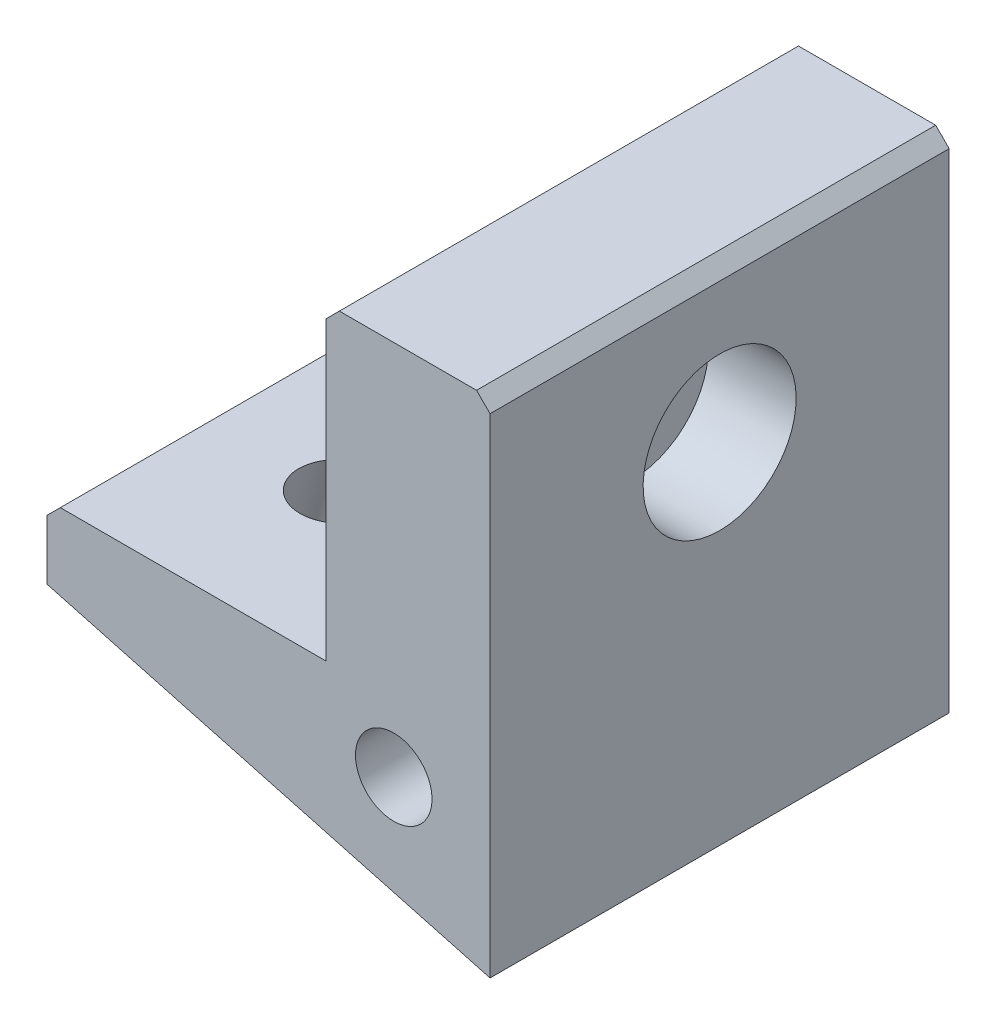
ISO-10303-21;
HEADER;
FILE_DESCRIPTION(('STEP AP214'),'2;1');
FILE_NAME('part.step','',(''),(''),'','','');
FILE_SCHEMA(('AUTOMOTIVE_DESIGN { 1 0 10303 214 1 1 1 1 }'));
ENDSEC;
DATA;
#1=APPLICATION_CONTEXT('core data for automotive mechanical design processes');
#2=APPLICATION_PROTOCOL_DEFINITION('international standard','automotive_design',2000,#1);
#3=PRODUCT_CONTEXT('',#1,'mechanical');
#4=PRODUCT('Part','Part','',(#3));
#5=PRODUCT_RELATED_PRODUCT_CATEGORY('part','',(#4));
#6=PRODUCT_DEFINITION_FORMATION('','',#4);
#7=PRODUCT_DEFINITION_CONTEXT('part definition',#1,'design');
#8=PRODUCT_DEFINITION('design','',#6,#7);
#9=PRODUCT_DEFINITION_SHAPE('','',#8);
#10=(LENGTH_UNIT() NAMED_UNIT(*) SI_UNIT(.MILLI.,.METRE.));
#11=(NAMED_UNIT(*) PLANE_ANGLE_UNIT() SI_UNIT($,.RADIAN.));
#12=(NAMED_UNIT(*) SI_UNIT($,.STERADIAN.) SOLID_ANGLE_UNIT());
#13=UNCERTAINTY_MEASURE_WITH_UNIT(LENGTH_MEASURE(1.E-05),#10,'distance_accuracy_value','');
#14=(GEOMETRIC_REPRESENTATION_CONTEXT(3) GLOBAL_UNCERTAINTY_ASSIGNED_CONTEXT((#13)) GLOBAL_UNIT_ASSIGNED_CONTEXT((#10,
#11,#12)) REPRESENTATION_CONTEXT('',''));
#15=CARTESIAN_POINT('',(0.,0.,0.));
#16=DIRECTION('',(0.,0.,1.));
#17=DIRECTION('',(1.,0.,0.));
#18=AXIS2_PLACEMENT_3D('',#15,#16,#17);
#19=CARTESIAN_POINT('',(0.,11.0097285067709,19.05));
#20=DIRECTION('',(0.,-1.,0.));
#21=DIRECTION('',(0.,0.,-1.));
#22=AXIS2_PLACEMENT_3D('',#19,#20,#21);
#23=PLANE('',#22);
#24=CARTESIAN_POINT('',(-6.89498166197876,11.0097285067709,6.35));
#25=DIRECTION('',(0.,-1.,0.));
#26=DIRECTION('',(-1.,0.,0.));
#27=AXIS2_PLACEMENT_3D('',#24,#25,#26);
#28=ELLIPSE('',#27,3.28854480018623,3.17499999999999);
#29=CARTESIAN_POINT('',(-10.183526462165,11.0097285067709,6.35));
#30=VERTEX_POINT('',#29);
#31=EDGE_CURVE('E188',#30,#30,#28,.T.);
#32=ORIENTED_EDGE('',*,*,#31,.T.);
#33=EDGE_LOOP('',(#32));
#34=FACE_BOUND('',#33,.T.);
#35=CARTESIAN_POINT('',(-6.89498166197876,11.0097285067709,-6.35));
#36=DIRECTION('',(0.,-1.,0.));
#37=DIRECTION('',(-1.,0.,0.));
#38=AXIS2_PLACEMENT_3D('',#35,#36,#37);
#39=ELLIPSE('',#38,3.28854480018623,3.17499999999999);
#40=CARTESIAN_POINT('',(-10.183526462165,11.0097285067709,-6.35));
#41=VERTEX_POINT('',#40);
#42=EDGE_CURVE('E179',#41,#41,#39,.T.);
#43=ORIENTED_EDGE('',*,*,#42,.T.);
#44=EDGE_LOOP('',(#43));
#45=FACE_BOUND('',#44,.T.);
#46=DIRECTION('',(-1.,0.,0.));
#47=VECTOR('',#46,1.);
#48=CARTESIAN_POINT('',(0.,11.0097285067709,-19.05));
#49=LINE('',#48,#47);
#50=CARTESIAN_POINT('',(4.7625,11.0097285067709,-19.05));
#51=VERTEX_POINT('',#50);
#52=CARTESIAN_POINT('',(-17.2697216031156,11.0097285067709,-19.05));
#53=VERTEX_POINT('',#52);
#54=EDGE_CURVE('E142',#51,#53,#49,.T.);
#55=ORIENTED_EDGE('',*,*,#54,.T.);
#56=DIRECTION('',(0.,0.,-1.));
#57=VECTOR('',#56,1.);
#58=CARTESIAN_POINT('',(-17.2697216031156,11.0097285067709,19.05));
#59=LINE('',#58,#57);
#60=CARTESIAN_POINT('',(-17.2697216031156,11.0097285067709,19.05));
#61=VERTEX_POINT('',#60);
#62=EDGE_CURVE('E11',#61,#53,#59,.T.);
#63=ORIENTED_EDGE('',*,*,#62,.F.);
#64=DIRECTION('',(-1.,0.,0.));
#65=VECTOR('',#64,1.);
#66=CARTESIAN_POINT('',(0.,11.0097285067709,19.05));
#67=LINE('',#66,#65);
#68=CARTESIAN_POINT('',(4.7625,11.0097285067709,19.05));
#69=VERTEX_POINT('',#68);
#70=EDGE_CURVE('E93',#69,#61,#67,.T.);
#71=ORIENTED_EDGE('',*,*,#70,.F.);
#72=DIRECTION('',(0.,0.,-1.));
#73=VECTOR('',#72,1.);
#74=CARTESIAN_POINT('',(4.7625,11.0097285067709,19.05));
#75=LINE('',#74,#73);
#76=EDGE_CURVE('E53',#69,#51,#75,.T.);
#77=ORIENTED_EDGE('',*,*,#76,.T.);
#78=EDGE_LOOP('',(#55,#63,#71,#77));
#79=FACE_BOUND('',#78,.T.);
#80=ADVANCED_FACE('F35',(#34,#45,#79),#23,.F.);
#81=CARTESIAN_POINT('',(-14.1397250549432,14.1397250549432,19.05));
#82=DIRECTION('',(-0.707106781186548,0.707106781186548,0.));
#83=DIRECTION('',(-0.707106781186548,-0.707106781186548,0.));
#84=AXIS2_PLACEMENT_3D('',#81,#82,#83);
#85=PLANE('',#84);
#86=DIRECTION('',(0.707106781186548,0.707106781186548,0.));
#87=VECTOR('',#86,1.);
#88=CARTESIAN_POINT('',(-14.1397250549432,14.1397250549432,-19.05));
#89=LINE('',#88,#87);
#90=CARTESIAN_POINT('',(-18.3922536182492,9.88719649163726,-19.05));
#91=VERTEX_POINT('',#90);
#92=EDGE_CURVE('E144',#91,#53,#89,.T.);
#93=ORIENTED_EDGE('',*,*,#92,.F.);
#94=DIRECTION('',(0.,0.,-1.));
#95=VECTOR('',#94,1.);
#96=CARTESIAN_POINT('',(-18.3922536182492,9.88719649163726,19.05));
#97=LINE('',#96,#95);
#98=CARTESIAN_POINT('',(-18.3922536182492,9.88719649163726,19.05));
#99=VERTEX_POINT('',#98);
#100=EDGE_CURVE('E44',#99,#91,#97,.T.);
#101=ORIENTED_EDGE('',*,*,#100,.F.);
#102=DIRECTION('',(0.707106781186548,0.707106781186548,0.));
#103=VECTOR('',#102,1.);
#104=CARTESIAN_POINT('',(-14.1397250549432,14.1397250549432,19.05));
#105=LINE('',#104,#103);
#106=EDGE_CURVE('E193',#99,#61,#105,.T.);
#107=ORIENTED_EDGE('',*,*,#106,.T.);
#108=ORIENTED_EDGE('',*,*,#62,.T.);
#109=EDGE_LOOP('',(#93,#101,#107,#108));
#110=FACE_BOUND('',#109,.T.);
#111=ADVANCED_FACE('F223',(#110),#85,.T.);
#112=CARTESIAN_POINT('',(-18.3922536182492,0.,19.05));
#113=DIRECTION('',(-1.,0.,0.));
#114=DIRECTION('',(0.,0.,1.));
#115=AXIS2_PLACEMENT_3D('',#112,#113,#114);
#116=PLANE('',#115);
#117=DIRECTION('',(0.,1.,0.));
#118=VECTOR('',#117,1.);
#119=CARTESIAN_POINT('',(-18.3922536182492,0.,-19.05));
#120=LINE('',#119,#118);
#121=CARTESIAN_POINT('',(-18.3922536182492,4.96261088964253,-19.05));
#122=VERTEX_POINT('',#121);
#123=EDGE_CURVE('E148',#122,#91,#120,.T.);
#124=ORIENTED_EDGE('',*,*,#123,.F.);
#125=DIRECTION('',(0.,0.,-1.));
#126=VECTOR('',#125,1.);
#127=CARTESIAN_POINT('',(-18.3922536182492,4.96261088964253,19.05));
#128=LINE('',#127,#126);
#129=CARTESIAN_POINT('',(-18.3922536182492,4.96261088964253,19.05));
#130=VERTEX_POINT('',#129);
#131=EDGE_CURVE('E176',#130,#122,#128,.T.);
#132=ORIENTED_EDGE('',*,*,#131,.F.);
#133=DIRECTION('',(0.,1.,0.));
#134=VECTOR('',#133,1.);
#135=CARTESIAN_POINT('',(-18.3922536182492,0.,19.05));
#136=LINE('',#135,#134);
#137=EDGE_CURVE('E196',#130,#99,#136,.T.);
#138=ORIENTED_EDGE('',*,*,#137,.T.);
#139=ORIENTED_EDGE('',*,*,#100,.T.);
#140=EDGE_LOOP('',(#124,#132,#138,#139));
#141=FACE_BOUND('',#140,.T.);
#142=ADVANCED_FACE('F228',(#141),#116,.T.);
#143=CARTESIAN_POINT('',(0.,0.,19.05));
#144=DIRECTION('',(0.260504508642652,0.965472630879224,0.));
#145=DIRECTION('',(-0.965472630879224,0.260504508642652,0.));
#146=AXIS2_PLACEMENT_3D('',#143,#144,#145);
#147=PLANE('',#146);
#148=CARTESIAN_POINT('',(-9.19612680912461,2.48130544482126,6.35));
#149=DIRECTION('',(-0.260504508642652,-0.965472630879224,0.));
#150=DIRECTION('',(0.965472630879224,-0.260504508642652,0.));
#151=AXIS2_PLACEMENT_3D('',#148,#149,#150);
#152=CIRCLE('',#151,3.17499999999999);
#153=CARTESIAN_POINT('',(-6.13075120608308,1.65420362988084,6.35));
#154=VERTEX_POINT('',#153);
#155=EDGE_CURVE('E388',#154,#154,#152,.T.);
#156=ORIENTED_EDGE('',*,*,#155,.F.);
#157=EDGE_LOOP('',(#156));
#158=FACE_BOUND('',#157,.T.);
#159=CARTESIAN_POINT('',(-9.19612680912461,2.48130544482126,-6.35));
#160=DIRECTION('',(-0.260504508642652,-0.965472630879224,0.));
#161=DIRECTION('',(0.965472630879224,-0.260504508642652,0.));
#162=AXIS2_PLACEMENT_3D('',#159,#160,#161);
#163=CIRCLE('',#162,3.17499999999999);
#164=CARTESIAN_POINT('',(-6.13075120608308,1.65420362988084,-6.35));
#165=VERTEX_POINT('',#164);
#166=EDGE_CURVE('E183',#165,#165,#163,.T.);
#167=ORIENTED_EDGE('',*,*,#166,.F.);
#168=EDGE_LOOP('',(#167));
#169=FACE_BOUND('',#168,.T.);
#170=DIRECTION('',(0.965472630879224,-0.260504508642652,0.));
#171=VECTOR('',#170,1.);
#172=CARTESIAN_POINT('',(0.,0.,-19.05));
#173=LINE('',#172,#171);
#174=CARTESIAN_POINT('',(18.3922536182492,-4.96261088964252,-19.05));
#175=VERTEX_POINT('',#174);
#176=EDGE_CURVE('E151',#122,#175,#173,.T.);
#177=ORIENTED_EDGE('',*,*,#176,.T.);
#178=DIRECTION('',(0.,0.,-1.));
#179=VECTOR('',#178,1.);
#180=CARTESIAN_POINT('',(18.3922536182492,-4.96261088964252,19.05));
#181=LINE('',#180,#179);
#182=CARTESIAN_POINT('',(18.3922536182492,-4.96261088964252,19.05));
#183=VERTEX_POINT('',#182);
#184=EDGE_CURVE('E174',#183,#175,#181,.T.);
#185=ORIENTED_EDGE('',*,*,#184,.F.);
#186=DIRECTION('',(0.965472630879224,-0.260504508642652,0.));
#187=VECTOR('',#186,1.);
#188=CARTESIAN_POINT('',(0.,0.,19.05));
#189=LINE('',#188,#187);
#190=EDGE_CURVE('E199',#130,#183,#189,.T.);
#191=ORIENTED_EDGE('',*,*,#190,.F.);
#192=ORIENTED_EDGE('',*,*,#131,.T.);
#193=EDGE_LOOP('',(#177,#185,#191,#192));
#194=FACE_BOUND('',#193,.T.);
#195=ADVANCED_FACE('F240',(#158,#169,#194),#147,.F.);
#196=CARTESIAN_POINT('',(18.3922536182492,0.,19.05));
#197=DIRECTION('',(1.,0.,0.));
#198=DIRECTION('',(0.,0.,-1.));
#199=AXIS2_PLACEMENT_3D('',#196,#197,#198);
#200=PLANE('',#199);
#201=CARTESIAN_POINT('',(18.3922536182492,24.0126108896425,0.));
#202=DIRECTION('',(-1.,0.,0.));
#203=DIRECTION('',(0.,-1.,0.));
#204=AXIS2_PLACEMENT_3D('',#201,#202,#203);
#205=CIRCLE('',#204,6.35);
#206=CARTESIAN_POINT('',(18.3922536182492,17.6626108896425,0.));
#207=VERTEX_POINT('',#206);
#208=EDGE_CURVE('E381',#207,#207,#205,.T.);
#209=ORIENTED_EDGE('',*,*,#208,.T.);
#210=EDGE_LOOP('',(#209));
#211=FACE_BOUND('',#210,.T.);
#212=DIRECTION('',(0.,-1.,0.));
#213=VECTOR('',#212,1.);
#214=CARTESIAN_POINT('',(18.3922536182492,0.,-19.05));
#215=LINE('',#214,#213);
#216=CARTESIAN_POINT('',(18.3922536182492,35.5900788745089,-19.05));
#217=VERTEX_POINT('',#216);
#218=EDGE_CURVE('E154',#217,#175,#215,.T.);
#219=ORIENTED_EDGE('',*,*,#218,.F.);
#220=DIRECTION('',(0.,0.,-1.));
#221=VECTOR('',#220,1.);
#222=CARTESIAN_POINT('',(18.3922536182492,35.5900788745089,19.05));
#223=LINE('',#222,#221);
#224=CARTESIAN_POINT('',(18.3922536182492,35.5900788745089,19.05));
#225=VERTEX_POINT('',#224);
#226=EDGE_CURVE('E172',#225,#217,#223,.T.);
#227=ORIENTED_EDGE('',*,*,#226,.F.);
#228=DIRECTION('',(0.,-1.,0.));
#229=VECTOR('',#228,1.);
#230=CARTESIAN_POINT('',(18.3922536182492,0.,19.05));
#231=LINE('',#230,#229);
#232=EDGE_CURVE('E201',#225,#183,#231,.T.);
#233=ORIENTED_EDGE('',*,*,#232,.T.);
#234=ORIENTED_EDGE('',*,*,#184,.T.);
#235=EDGE_LOOP('',(#219,#227,#233,#234));
#236=FACE_BOUND('',#235,.T.);
#237=ADVANCED_FACE('F242',(#211,#236),#200,.T.);
#238=CARTESIAN_POINT('',(26.991166246379,26.991166246379,19.05));
#239=DIRECTION('',(0.707106781186548,0.707106781186548,0.));
#240=DIRECTION('',(-0.707106781186548,0.707106781186548,0.));
#241=AXIS2_PLACEMENT_3D('',#238,#239,#240);
#242=PLANE('',#241);
#243=DIRECTION('',(0.707106781186548,-0.707106781186548,0.));
#244=VECTOR('',#243,1.);
#245=CARTESIAN_POINT('',(26.991166246379,26.991166246379,-19.05));
#246=LINE('',#245,#244);
#247=CARTESIAN_POINT('',(17.2697216031156,36.7126108896425,-19.05));
#248=VERTEX_POINT('',#247);
#249=EDGE_CURVE('E157',#248,#217,#246,.T.);
#250=ORIENTED_EDGE('',*,*,#249,.F.);
#251=DIRECTION('',(0.,0.,-1.));
#252=VECTOR('',#251,1.);
#253=CARTESIAN_POINT('',(17.2697216031156,36.7126108896425,19.05));
#254=LINE('',#253,#252);
#255=CARTESIAN_POINT('',(17.2697216031156,36.7126108896425,19.05));
#256=VERTEX_POINT('',#255);
#257=EDGE_CURVE('E122',#256,#248,#254,.T.);
#258=ORIENTED_EDGE('',*,*,#257,.F.);
#259=DIRECTION('',(0.707106781186548,-0.707106781186548,0.));
#260=VECTOR('',#259,1.);
#261=CARTESIAN_POINT('',(26.991166246379,26.991166246379,19.05));
#262=LINE('',#261,#260);
#263=EDGE_CURVE('E131',#256,#225,#262,.T.);
#264=ORIENTED_EDGE('',*,*,#263,.T.);
#265=ORIENTED_EDGE('',*,*,#226,.T.);
#266=EDGE_LOOP('',(#250,#258,#264,#265));
#267=FACE_BOUND('',#266,.T.);
#268=ADVANCED_FACE('F205',(#267),#242,.T.);
#269=CARTESIAN_POINT('',(0.,36.7126108896425,19.05));
#270=DIRECTION('',(0.,1.,0.));
#271=DIRECTION('',(-1.,0.,0.));
#272=AXIS2_PLACEMENT_3D('',#269,#270,#271);
#273=PLANE('',#272);
#274=DIRECTION('',(1.,0.,0.));
#275=VECTOR('',#274,1.);
#276=CARTESIAN_POINT('',(0.,36.7126108896425,-19.05));
#277=LINE('',#276,#275);
#278=CARTESIAN_POINT('',(5.88503201513365,36.7126108896425,-19.05));
#279=VERTEX_POINT('',#278);
#280=EDGE_CURVE('E118',#279,#248,#277,.T.);
#281=ORIENTED_EDGE('',*,*,#280,.F.);
#282=DIRECTION('',(0.,0.,-1.));
#283=VECTOR('',#282,1.);
#284=CARTESIAN_POINT('',(5.88503201513365,36.7126108896425,19.05));
#285=LINE('',#284,#283);
#286=CARTESIAN_POINT('',(5.88503201513365,36.7126108896425,19.05));
#287=VERTEX_POINT('',#286);
#288=EDGE_CURVE('E113',#287,#279,#285,.T.);
#289=ORIENTED_EDGE('',*,*,#288,.F.);
#290=DIRECTION('',(1.,0.,0.));
#291=VECTOR('',#290,1.);
#292=CARTESIAN_POINT('',(0.,36.7126108896425,19.05));
#293=LINE('',#292,#291);
#294=EDGE_CURVE('E116',#287,#256,#293,.T.);
#295=ORIENTED_EDGE('',*,*,#294,.T.);
#296=ORIENTED_EDGE('',*,*,#257,.T.);
#297=EDGE_LOOP('',(#281,#289,#295,#296));
#298=FACE_BOUND('',#297,.T.);
#299=ADVANCED_FACE('F115',(#298),#273,.T.);
#300=CARTESIAN_POINT('',(-15.4137894372545,15.4137894372545,19.05));
#301=DIRECTION('',(-0.707106781186546,0.707106781186549,0.));
#302=DIRECTION('',(-0.707106781186549,-0.707106781186546,0.));
#303=AXIS2_PLACEMENT_3D('',#300,#301,#302);
#304=PLANE('',#303);
#305=DIRECTION('',(0.707106781186549,0.707106781186546,0.));
#306=VECTOR('',#305,1.);
#307=CARTESIAN_POINT('',(-15.4137894372545,15.4137894372545,-19.05));
#308=LINE('',#307,#306);
#309=CARTESIAN_POINT('',(4.7625,35.5900788745089,-19.05));
#310=VERTEX_POINT('',#309);
#311=EDGE_CURVE('E161',#310,#279,#308,.T.);
#312=ORIENTED_EDGE('',*,*,#311,.F.);
#313=DIRECTION('',(0.,0.,-1.));
#314=VECTOR('',#313,1.);
#315=CARTESIAN_POINT('',(4.7625,35.5900788745089,19.05));
#316=LINE('',#315,#314);
#317=CARTESIAN_POINT('',(4.7625,35.5900788745089,19.05));
#318=VERTEX_POINT('',#317);
#319=EDGE_CURVE('E81',#318,#310,#316,.T.);
#320=ORIENTED_EDGE('',*,*,#319,.F.);
#321=DIRECTION('',(0.707106781186549,0.707106781186546,0.));
#322=VECTOR('',#321,1.);
#323=CARTESIAN_POINT('',(-15.4137894372545,15.4137894372545,19.05));
#324=LINE('',#323,#322);
#325=EDGE_CURVE('E128',#318,#287,#324,.T.);
#326=ORIENTED_EDGE('',*,*,#325,.T.);
#327=ORIENTED_EDGE('',*,*,#288,.T.);
#328=EDGE_LOOP('',(#312,#320,#326,#327));
#329=FACE_BOUND('',#328,.T.);
#330=ADVANCED_FACE('F133',(#329),#304,.T.);
#331=CARTESIAN_POINT('',(4.7625,0.,19.05));
#332=DIRECTION('',(-1.,0.,0.));
#333=DIRECTION('',(0.,-1.,0.));
#334=AXIS2_PLACEMENT_3D('',#331,#332,#333);
#335=PLANE('',#334);
#336=CARTESIAN_POINT('',(4.7625,24.0126108896425,0.));
#337=DIRECTION('',(-1.,0.,0.));
#338=DIRECTION('',(0.,-1.,0.));
#339=AXIS2_PLACEMENT_3D('',#336,#337,#338);
#340=CIRCLE('',#339,3.175);
#341=CARTESIAN_POINT('',(4.7625,20.8376108896425,0.));
#342=VERTEX_POINT('',#341);
#343=EDGE_CURVE('E145',#342,#342,#340,.T.);
#344=ORIENTED_EDGE('',*,*,#343,.F.);
#345=EDGE_LOOP('',(#344));
#346=FACE_BOUND('',#345,.T.);
#347=DIRECTION('',(0.,1.,0.));
#348=VECTOR('',#347,1.);
#349=CARTESIAN_POINT('',(4.7625,0.,-19.05));
#350=LINE('',#349,#348);
#351=EDGE_CURVE('E163',#51,#310,#350,.T.);
#352=ORIENTED_EDGE('',*,*,#351,.F.);
#353=ORIENTED_EDGE('',*,*,#76,.F.);
#354=DIRECTION('',(0.,1.,0.));
#355=VECTOR('',#354,1.);
#356=CARTESIAN_POINT('',(4.7625,0.,19.05));
#357=LINE('',#356,#355);
#358=EDGE_CURVE('E134',#69,#318,#357,.T.);
#359=ORIENTED_EDGE('',*,*,#358,.T.);
#360=ORIENTED_EDGE('',*,*,#319,.T.);
#361=EDGE_LOOP('',(#352,#353,#359,#360));
#362=FACE_BOUND('',#361,.T.);
#363=ADVANCED_FACE('F210',(#346,#362),#335,.T.);
#364=CARTESIAN_POINT('',(10.3979607447915,5.47460078069408,19.05));
#365=DIRECTION('',(0.,0.,-1.));
#366=DIRECTION('',(-1.,0.,0.));
#367=AXIS2_PLACEMENT_3D('',#364,#365,#366);
#368=CYLINDRICAL_SURFACE('',#367,3.175);
#369=CARTESIAN_POINT('',(10.3979607447915,5.47460078069408,19.05));
#370=DIRECTION('',(0.,0.,1.));
#371=DIRECTION('',(1.,0.,0.));
#372=AXIS2_PLACEMENT_3D('',#369,#370,#371);
#373=CIRCLE('',#372,3.175);
#374=CARTESIAN_POINT('',(7.22296074479154,5.47460078069408,19.05));
#375=VERTEX_POINT('',#374);
#376=EDGE_CURVE('E136',#375,#375,#373,.T.);
#377=CARTESIAN_POINT('',(10.3979607447915,5.47460078069408,-19.05));
#378=DIRECTION('',(0.,0.,1.));
#379=DIRECTION('',(1.,0.,0.));
#380=AXIS2_PLACEMENT_3D('',#377,#378,#379);
#381=CIRCLE('',#380,3.175);
#382=CARTESIAN_POINT('',(7.22296074479154,5.47460078069408,-19.05));
#383=VERTEX_POINT('',#382);
#384=EDGE_CURVE('E166',#383,#383,#381,.T.);
#385=CARTESIAN_POINT('',(7.22296074479154,5.47460078069408,19.05));
#386=CARTESIAN_POINT('',(7.22296074479154,5.47460078069408,18.653125));
#387=CARTESIAN_POINT('',(7.22296074479154,5.47460078069408,18.25625));
#388=CARTESIAN_POINT('',(7.22296074479154,5.47460078069408,17.4625));
#389=CARTESIAN_POINT('',(7.22296074479154,5.47460078069408,17.065625));
#390=CARTESIAN_POINT('',(7.22296074479154,5.47460078069408,16.271875));
#391=CARTESIAN_POINT('',(7.22296074479154,5.47460078069408,15.875));
#392=CARTESIAN_POINT('',(7.22296074479154,5.47460078069408,15.08125));
#393=CARTESIAN_POINT('',(7.22296074479154,5.47460078069408,14.684375));
#394=CARTESIAN_POINT('',(7.22296074479154,5.47460078069408,13.890625));
#395=CARTESIAN_POINT('',(7.22296074479154,5.47460078069408,13.49375));
#396=CARTESIAN_POINT('',(7.22296074479154,5.47460078069408,12.7));
#397=CARTESIAN_POINT('',(7.22296074479154,5.47460078069408,12.303125));
#398=CARTESIAN_POINT('',(7.22296074479154,5.47460078069408,11.509375));
#399=CARTESIAN_POINT('',(7.22296074479154,5.47460078069408,11.1125));
#400=CARTESIAN_POINT('',(7.22296074479154,5.47460078069408,10.31875));
#401=CARTESIAN_POINT('',(7.22296074479154,5.47460078069408,9.921875));
#402=CARTESIAN_POINT('',(7.22296074479154,5.47460078069408,9.128125));
#403=CARTESIAN_POINT('',(7.22296074479154,5.47460078069408,8.73125));
#404=CARTESIAN_POINT('',(7.22296074479154,5.47460078069408,7.9375));
#405=CARTESIAN_POINT('',(7.22296074479154,5.47460078069408,7.540625));
#406=CARTESIAN_POINT('',(7.22296074479154,5.47460078069408,6.746875));
#407=CARTESIAN_POINT('',(7.22296074479154,5.47460078069408,6.35));
#408=CARTESIAN_POINT('',(7.22296074479154,5.47460078069408,5.55625));
#409=CARTESIAN_POINT('',(7.22296074479154,5.47460078069408,5.159375));
#410=CARTESIAN_POINT('',(7.22296074479154,5.47460078069408,4.365625));
#411=CARTESIAN_POINT('',(7.22296074479154,5.47460078069408,3.96875));
#412=CARTESIAN_POINT('',(7.22296074479154,5.47460078069408,3.175));
#413=CARTESIAN_POINT('',(7.22296074479154,5.47460078069408,2.778125));
#414=CARTESIAN_POINT('',(7.22296074479154,5.47460078069408,1.984375));
#415=CARTESIAN_POINT('',(7.22296074479154,5.47460078069408,1.5875));
#416=CARTESIAN_POINT('',(7.22296074479154,5.47460078069408,0.79375));
#417=CARTESIAN_POINT('',(7.22296074479154,5.47460078069408,0.396875));
#418=CARTESIAN_POINT('',(7.22296074479154,5.47460078069408,-0.396875));
#419=CARTESIAN_POINT('',(7.22296074479154,5.47460078069408,-0.79375));
#420=CARTESIAN_POINT('',(7.22296074479154,5.47460078069408,-1.5875));
#421=CARTESIAN_POINT('',(7.22296074479154,5.47460078069408,-1.984375));
#422=CARTESIAN_POINT('',(7.22296074479154,5.47460078069408,-2.778125));
#423=CARTESIAN_POINT('',(7.22296074479154,5.47460078069408,-3.175));
#424=CARTESIAN_POINT('',(7.22296074479154,5.47460078069408,-3.96875));
#425=CARTESIAN_POINT('',(7.22296074479154,5.47460078069408,-4.365625));
#426=CARTESIAN_POINT('',(7.22296074479154,5.47460078069408,-5.159375));
#427=CARTESIAN_POINT('',(7.22296074479154,5.47460078069408,-5.55625));
#428=CARTESIAN_POINT('',(7.22296074479154,5.47460078069408,-6.35));
#429=CARTESIAN_POINT('',(7.22296074479154,5.47460078069408,-6.746875));
#430=CARTESIAN_POINT('',(7.22296074479154,5.47460078069408,-7.540625));
#431=CARTESIAN_POINT('',(7.22296074479154,5.47460078069408,-7.9375));
#432=CARTESIAN_POINT('',(7.22296074479154,5.47460078069408,-8.73125));
#433=CARTESIAN_POINT('',(7.22296074479154,5.47460078069408,-9.128125));
#434=CARTESIAN_POINT('',(7.22296074479154,5.47460078069408,-9.921875));
#435=CARTESIAN_POINT('',(7.22296074479154,5.47460078069408,-10.31875));
#436=CARTESIAN_POINT('',(7.22296074479154,5.47460078069408,-11.1125));
#437=CARTESIAN_POINT('',(7.22296074479154,5.47460078069408,-11.509375));
#438=CARTESIAN_POINT('',(7.22296074479154,5.47460078069408,-12.303125));
#439=CARTESIAN_POINT('',(7.22296074479154,5.47460078069408,-12.7));
#440=CARTESIAN_POINT('',(7.22296074479154,5.47460078069408,-13.49375));
#441=CARTESIAN_POINT('',(7.22296074479154,5.47460078069408,-13.890625));
#442=CARTESIAN_POINT('',(7.22296074479154,5.47460078069408,-14.684375));
#443=CARTESIAN_POINT('',(7.22296074479154,5.47460078069408,-15.08125));
#444=CARTESIAN_POINT('',(7.22296074479154,5.47460078069408,-15.875));
#445=CARTESIAN_POINT('',(7.22296074479154,5.47460078069408,-16.271875));
#446=CARTESIAN_POINT('',(7.22296074479154,5.47460078069408,-17.065625));
#447=CARTESIAN_POINT('',(7.22296074479154,5.47460078069408,-17.4625));
#448=CARTESIAN_POINT('',(7.22296074479154,5.47460078069408,-18.25625));
#449=CARTESIAN_POINT('',(7.22296074479154,5.47460078069408,-18.653125));
#450=CARTESIAN_POINT('',(7.22296074479154,5.47460078069408,-19.05));
#451=B_SPLINE_CURVE_WITH_KNOTS('',3,(#385,#386,#387,#388,#389,#390,#391,#392,#393,#394,#395,
#396,#397,#398,#399,#400,#401,#402,#403,#404,#405,#406,#407,#408,#409,#410,#411,#412,#413,#414,
#415,#416,#417,#418,#419,#420,#421,#422,#423,#424,#425,#426,#427,#428,#429,#430,#431,#432,#433,
#434,#435,#436,#437,#438,#439,#440,#441,#442,#443,#444,#445,#446,#447,#448,#449,#450),
.UNSPECIFIED.,.F.,.F.,(4,2,2,2,2,2,2,2,2,2,2,2,2,2,2,2,2,2,2,2,2,2,2,2,2,2,2,2,2,2,2,2,4),(0.,
1.190625,2.38125,3.571875,4.7625,5.953125,7.14375,8.334375,9.525,10.715625,11.90625,13.096875,
14.2875,15.478125,16.66875,17.859375,19.05,20.240625,21.43125,22.621875,23.8125,25.003125,
26.19375,27.384375,28.575,29.765625,30.95625,32.146875,33.3375,34.528125,35.71875,36.909375,
38.1),.UNSPECIFIED.);
#452=EDGE_CURVE('BSEAM212',#375,#383,#451,.T.);
#453=ORIENTED_EDGE('',*,*,#376,.T.);
#454=ORIENTED_EDGE('',*,*,#384,.F.);
#455=ORIENTED_EDGE('',*,*,#452,.T.);
#456=ORIENTED_EDGE('',*,*,#452,.F.);
#457=EDGE_LOOP('',(#453,#455,#454,#456));
#458=FACE_BOUND('',#457,.T.);
#459=ADVANCED_FACE('F212',(#458),#368,.F.);
#460=CARTESIAN_POINT('',(0.,0.,19.05));
#461=DIRECTION('',(0.,0.,1.));
#462=DIRECTION('',(1.,0.,0.));
#463=AXIS2_PLACEMENT_3D('',#460,#461,#462);
#464=PLANE('',#463);
#465=ORIENTED_EDGE('',*,*,#70,.T.);
#466=ORIENTED_EDGE('',*,*,#106,.F.);
#467=ORIENTED_EDGE('',*,*,#137,.F.);
#468=ORIENTED_EDGE('',*,*,#190,.T.);
#469=ORIENTED_EDGE('',*,*,#232,.F.);
#470=ORIENTED_EDGE('',*,*,#263,.F.);
#471=ORIENTED_EDGE('',*,*,#294,.F.);
#472=ORIENTED_EDGE('',*,*,#325,.F.);
#473=ORIENTED_EDGE('',*,*,#358,.F.);
#474=EDGE_LOOP('',(#465,#466,#467,#468,#469,#470,#471,#472,#473));
#475=FACE_BOUND('',#474,.T.);
#476=ORIENTED_EDGE('',*,*,#376,.F.);
#477=EDGE_LOOP('',(#476));
#478=FACE_BOUND('',#477,.T.);
#479=ADVANCED_FACE('F126',(#475,#478),#464,.T.);
#480=CARTESIAN_POINT('',(0.,0.,-19.05));
#481=DIRECTION('',(0.,0.,1.));
#482=DIRECTION('',(1.,0.,0.));
#483=AXIS2_PLACEMENT_3D('',#480,#481,#482);
#484=PLANE('',#483);
#485=ORIENTED_EDGE('',*,*,#54,.F.);
#486=ORIENTED_EDGE('',*,*,#351,.T.);
#487=ORIENTED_EDGE('',*,*,#311,.T.);
#488=ORIENTED_EDGE('',*,*,#280,.T.);
#489=ORIENTED_EDGE('',*,*,#249,.T.);
#490=ORIENTED_EDGE('',*,*,#218,.T.);
#491=ORIENTED_EDGE('',*,*,#176,.F.);
#492=ORIENTED_EDGE('',*,*,#123,.T.);
#493=ORIENTED_EDGE('',*,*,#92,.T.);
#494=EDGE_LOOP('',(#485,#486,#487,#488,#489,#490,#491,#492,#493));
#495=FACE_BOUND('',#494,.T.);
#496=ORIENTED_EDGE('',*,*,#384,.T.);
#497=EDGE_LOOP('',(#496));
#498=FACE_BOUND('',#497,.T.);
#499=ADVANCED_FACE('F208',(#495,#498),#484,.F.);
#500=CARTESIAN_POINT('',(-18.3922536182492,24.0126108896425,0.));
#501=DIRECTION('',(1.,0.,0.));
#502=DIRECTION('',(0.,1.,0.));
#503=AXIS2_PLACEMENT_3D('',#500,#501,#502);
#504=CYLINDRICAL_SURFACE('',#503,3.175);
#505=CARTESIAN_POINT('',(11.1125,24.0126108896425,0.));
#506=DIRECTION('',(-1.,0.,0.));
#507=DIRECTION('',(0.,-1.,0.));
#508=AXIS2_PLACEMENT_3D('',#505,#506,#507);
#509=CIRCLE('',#508,3.175);
#510=CARTESIAN_POINT('',(11.1125,20.8376108896425,0.));
#511=VERTEX_POINT('',#510);
#512=EDGE_CURVE('E38',#511,#511,#509,.F.);
#513=ORIENTED_EDGE('',*,*,#512,.T.);
#514=EDGE_LOOP('',(#513));
#515=FACE_BOUND('',#514,.T.);
#516=ORIENTED_EDGE('',*,*,#343,.T.);
#517=EDGE_LOOP('',(#516));
#518=FACE_BOUND('',#517,.T.);
#519=ADVANCED_FACE('F280',(#515,#518),#504,.F.);
#520=CARTESIAN_POINT('',(-9.19612680912461,2.48130544482126,-6.35));
#521=DIRECTION('',(-0.260504508642652,-0.965472630879224,0.));
#522=DIRECTION('',(0.965472630879224,-0.260504508642652,0.));
#523=AXIS2_PLACEMENT_3D('',#520,#521,#522);
#524=CYLINDRICAL_SURFACE('',#523,3.17499999999999);
#525=ORIENTED_EDGE('',*,*,#166,.T.);
#526=EDGE_LOOP('',(#525));
#527=FACE_BOUND('',#526,.T.);
#528=ORIENTED_EDGE('',*,*,#42,.F.);
#529=EDGE_LOOP('',(#528));
#530=FACE_BOUND('',#529,.T.);
#531=ADVANCED_FACE('F274',(#527,#530),#524,.F.);
#532=CARTESIAN_POINT('',(-9.19612680912461,2.48130544482126,6.35));
#533=DIRECTION('',(-0.260504508642652,-0.965472630879224,0.));
#534=DIRECTION('',(0.965472630879224,-0.260504508642652,0.));
#535=AXIS2_PLACEMENT_3D('',#532,#533,#534);
#536=CYLINDRICAL_SURFACE('',#535,3.17499999999999);
#537=ORIENTED_EDGE('',*,*,#155,.T.);
#538=EDGE_LOOP('',(#537));
#539=FACE_BOUND('',#538,.T.);
#540=ORIENTED_EDGE('',*,*,#31,.F.);
#541=EDGE_LOOP('',(#540));
#542=FACE_BOUND('',#541,.T.);
#543=ADVANCED_FACE('F279',(#539,#542),#536,.F.);
#544=CARTESIAN_POINT('',(11.1125,24.0126108896425,0.));
#545=DIRECTION('',(-1.,0.,0.));
#546=DIRECTION('',(0.,-1.,0.));
#547=AXIS2_PLACEMENT_3D('',#544,#545,#546);
#548=PLANE('',#547);
#549=CARTESIAN_POINT('',(11.1125,24.0126108896425,0.));
#550=DIRECTION('',(-1.,0.,0.));
#551=DIRECTION('',(0.,-1.,0.));
#552=AXIS2_PLACEMENT_3D('',#549,#550,#551);
#553=CIRCLE('',#552,6.35);
#554=CARTESIAN_POINT('',(11.1125,17.6626108896425,0.));
#555=VERTEX_POINT('',#554);
#556=EDGE_CURVE('E384',#555,#555,#553,.T.);
#557=ORIENTED_EDGE('',*,*,#556,.F.);
#558=EDGE_LOOP('',(#557));
#559=FACE_BOUND('',#558,.T.);
#560=ORIENTED_EDGE('',*,*,#512,.F.);
#561=EDGE_LOOP('',(#560));
#562=FACE_BOUND('',#561,.T.);
#563=ADVANCED_FACE('F291',(#559,#562),#548,.F.);
#564=CARTESIAN_POINT('',(18.3922536182492,24.0126108896425,0.));
#565=DIRECTION('',(-1.,0.,0.));
#566=DIRECTION('',(0.,-1.,0.));
#567=AXIS2_PLACEMENT_3D('',#564,#565,#566);
#568=CYLINDRICAL_SURFACE('',#567,6.35);
#569=ORIENTED_EDGE('',*,*,#208,.F.);
#570=EDGE_LOOP('',(#569));
#571=FACE_BOUND('',#570,.T.);
#572=ORIENTED_EDGE('',*,*,#556,.T.);
#573=EDGE_LOOP('',(#572));
#574=FACE_BOUND('',#573,.T.);
#575=ADVANCED_FACE('F315',(#571,#574),#568,.F.);
#576=CLOSED_SHELL('',(#80,#111,#142,#195,#237,#268,#299,#330,#363,#459,#479,#499,#519,#531,#543,
#563,#575));
#577=MANIFOLD_SOLID_BREP('B2',#576);
#578=ADVANCED_BREP_SHAPE_REPRESENTATION('',(#18,#577),#14);
#579=SHAPE_DEFINITION_REPRESENTATION(#9,#578);
ENDSEC;
END-ISO-10303-21;
